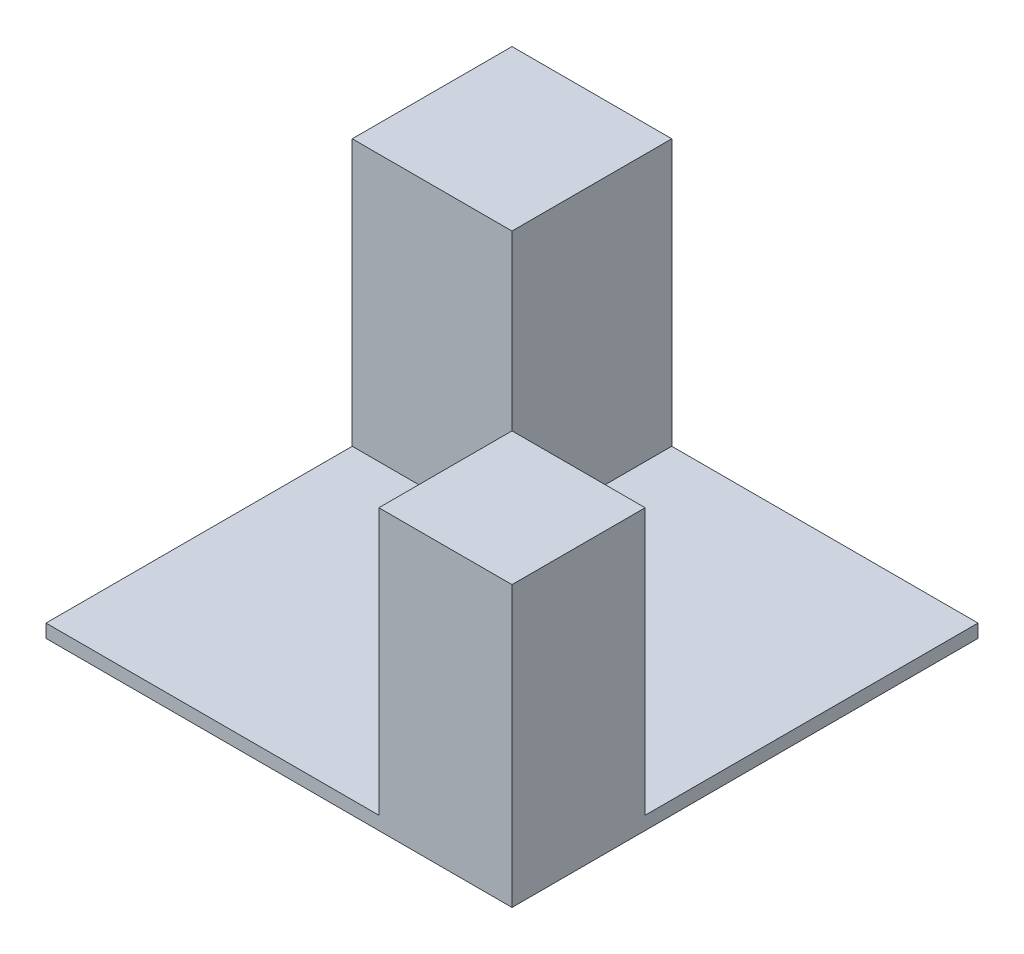
ISO-10303-21;
HEADER;
FILE_DESCRIPTION(('STEP AP214'),'2;1');
FILE_NAME('part.step','',(''),(''),'','','');
FILE_SCHEMA(('AUTOMOTIVE_DESIGN { 1 0 10303 214 1 1 1 1 }'));
ENDSEC;
DATA;
#1=APPLICATION_CONTEXT('core data for automotive mechanical design processes');
#2=APPLICATION_PROTOCOL_DEFINITION('international standard','automotive_design',2000,#1);
#3=PRODUCT_CONTEXT('',#1,'mechanical');
#4=PRODUCT('Part','Part','',(#3));
#5=PRODUCT_RELATED_PRODUCT_CATEGORY('part','',(#4));
#6=PRODUCT_DEFINITION_FORMATION('','',#4);
#7=PRODUCT_DEFINITION_CONTEXT('part definition',#1,'design');
#8=PRODUCT_DEFINITION('design','',#6,#7);
#9=PRODUCT_DEFINITION_SHAPE('','',#8);
#10=(LENGTH_UNIT() NAMED_UNIT(*) SI_UNIT(.MILLI.,.METRE.));
#11=(NAMED_UNIT(*) PLANE_ANGLE_UNIT() SI_UNIT($,.RADIAN.));
#12=(NAMED_UNIT(*) SI_UNIT($,.STERADIAN.) SOLID_ANGLE_UNIT());
#13=UNCERTAINTY_MEASURE_WITH_UNIT(LENGTH_MEASURE(1.E-05),#10,'distance_accuracy_value','');
#14=(GEOMETRIC_REPRESENTATION_CONTEXT(3) GLOBAL_UNCERTAINTY_ASSIGNED_CONTEXT((#13)) GLOBAL_UNIT_ASSIGNED_CONTEXT((#10,
#11,#12)) REPRESENTATION_CONTEXT('',''));
#15=CARTESIAN_POINT('',(0.,0.,0.));
#16=DIRECTION('',(0.,0.,1.));
#17=DIRECTION('',(1.,0.,0.));
#18=AXIS2_PLACEMENT_3D('',#15,#16,#17);
#19=CARTESIAN_POINT('',(0.,1.,0.));
#20=DIRECTION('',(0.,-1.,0.));
#21=DIRECTION('',(0.,0.,-1.));
#22=AXIS2_PLACEMENT_3D('',#19,#20,#21);
#23=PLANE('',#22);
#24=DIRECTION('',(-1.,0.,0.));
#25=VECTOR('',#24,1.);
#26=CARTESIAN_POINT('',(35.,1.,-10.));
#27=LINE('',#26,#25);
#28=CARTESIAN_POINT('',(35.,1.,-10.));
#29=VERTEX_POINT('',#28);
#30=CARTESIAN_POINT('',(25.,1.,-10.));
#31=VERTEX_POINT('',#30);
#32=EDGE_CURVE('E233',#29,#31,#27,.T.);
#33=ORIENTED_EDGE('',*,*,#32,.F.);
#34=DIRECTION('',(0.,0.,-1.));
#35=VECTOR('',#34,1.);
#36=CARTESIAN_POINT('',(35.,1.,0.));
#37=LINE('',#36,#35);
#38=CARTESIAN_POINT('',(35.,1.,-35.));
#39=VERTEX_POINT('',#38);
#40=EDGE_CURVE('E131',#29,#39,#37,.T.);
#41=ORIENTED_EDGE('',*,*,#40,.T.);
#42=DIRECTION('',(-1.,0.,0.));
#43=VECTOR('',#42,1.);
#44=CARTESIAN_POINT('',(0.,1.,-35.));
#45=LINE('',#44,#43);
#46=CARTESIAN_POINT('',(12.,1.,-35.));
#47=VERTEX_POINT('',#46);
#48=EDGE_CURVE('E168',#39,#47,#45,.T.);
#49=ORIENTED_EDGE('',*,*,#48,.T.);
#50=DIRECTION('',(0.,0.,-1.));
#51=VECTOR('',#50,1.);
#52=CARTESIAN_POINT('',(12.,1.,-35.));
#53=LINE('',#52,#51);
#54=CARTESIAN_POINT('',(12.,1.,-23.));
#55=VERTEX_POINT('',#54);
#56=EDGE_CURVE('E135',#55,#47,#53,.T.);
#57=ORIENTED_EDGE('',*,*,#56,.F.);
#58=DIRECTION('',(1.,0.,0.));
#59=VECTOR('',#58,1.);
#60=CARTESIAN_POINT('',(0.,1.,-23.));
#61=LINE('',#60,#59);
#62=CARTESIAN_POINT('',(0.,1.,-23.));
#63=VERTEX_POINT('',#62);
#64=EDGE_CURVE('E132',#63,#55,#61,.T.);
#65=ORIENTED_EDGE('',*,*,#64,.F.);
#66=DIRECTION('',(0.,0.,1.));
#67=VECTOR('',#66,1.);
#68=CARTESIAN_POINT('',(0.,1.,0.));
#69=LINE('',#68,#67);
#70=CARTESIAN_POINT('',(0.,1.,0.));
#71=VERTEX_POINT('',#70);
#72=EDGE_CURVE('E163',#63,#71,#69,.T.);
#73=ORIENTED_EDGE('',*,*,#72,.T.);
#74=DIRECTION('',(1.,0.,0.));
#75=VECTOR('',#74,1.);
#76=CARTESIAN_POINT('',(0.,1.,0.));
#77=LINE('',#76,#75);
#78=CARTESIAN_POINT('',(25.,1.,0.));
#79=VERTEX_POINT('',#78);
#80=EDGE_CURVE('E53',#71,#79,#77,.T.);
#81=ORIENTED_EDGE('',*,*,#80,.T.);
#82=DIRECTION('',(0.,0.,1.));
#83=VECTOR('',#82,1.);
#84=CARTESIAN_POINT('',(25.,1.,0.));
#85=LINE('',#84,#83);
#86=EDGE_CURVE('E48',#31,#79,#85,.T.);
#87=ORIENTED_EDGE('',*,*,#86,.F.);
#88=EDGE_LOOP('',(#33,#41,#49,#57,#65,#73,#81,#87));
#89=FACE_BOUND('',#88,.T.);
#90=ADVANCED_FACE('F33',(#89),#23,.F.);
#91=CARTESIAN_POINT('',(0.,1.,0.));
#92=DIRECTION('',(1.,0.,0.));
#93=DIRECTION('',(0.,0.,-1.));
#94=AXIS2_PLACEMENT_3D('',#91,#92,#93);
#95=PLANE('',#94);
#96=DIRECTION('',(0.,0.,1.));
#97=VECTOR('',#96,1.);
#98=CARTESIAN_POINT('',(0.,0.,0.));
#99=LINE('',#98,#97);
#100=CARTESIAN_POINT('',(0.,0.,-35.));
#101=VERTEX_POINT('',#100);
#102=CARTESIAN_POINT('',(0.,0.,0.));
#103=VERTEX_POINT('',#102);
#104=EDGE_CURVE('E162',#101,#103,#99,.T.);
#105=ORIENTED_EDGE('',*,*,#104,.T.);
#106=DIRECTION('',(0.,-1.,0.));
#107=VECTOR('',#106,1.);
#108=CARTESIAN_POINT('',(0.,1.,0.));
#109=LINE('',#108,#107);
#110=EDGE_CURVE('E11',#71,#103,#109,.T.);
#111=ORIENTED_EDGE('',*,*,#110,.F.);
#112=ORIENTED_EDGE('',*,*,#72,.F.);
#113=DIRECTION('',(0.,-1.,0.));
#114=VECTOR('',#113,1.);
#115=CARTESIAN_POINT('',(0.,21.,-23.));
#116=LINE('',#115,#114);
#117=CARTESIAN_POINT('',(0.,21.,-23.));
#118=VERTEX_POINT('',#117);
#119=EDGE_CURVE('E159',#118,#63,#116,.T.);
#120=ORIENTED_EDGE('',*,*,#119,.F.);
#121=DIRECTION('',(0.,0.,1.));
#122=VECTOR('',#121,1.);
#123=CARTESIAN_POINT('',(0.,21.,-35.));
#124=LINE('',#123,#122);
#125=CARTESIAN_POINT('',(0.,21.,-35.));
#126=VERTEX_POINT('',#125);
#127=EDGE_CURVE('E141',#126,#118,#124,.T.);
#128=ORIENTED_EDGE('',*,*,#127,.F.);
#129=DIRECTION('',(0.,-1.,0.));
#130=VECTOR('',#129,1.);
#131=CARTESIAN_POINT('',(0.,1.,-35.));
#132=LINE('',#131,#130);
#133=EDGE_CURVE('E170',#126,#101,#132,.T.);
#134=ORIENTED_EDGE('',*,*,#133,.T.);
#135=EDGE_LOOP('',(#105,#111,#112,#120,#128,#134));
#136=FACE_BOUND('',#135,.T.);
#137=ADVANCED_FACE('F35',(#136),#95,.F.);
#138=CARTESIAN_POINT('',(0.,1.,0.));
#139=DIRECTION('',(0.,0.,-1.));
#140=DIRECTION('',(-1.,0.,0.));
#141=AXIS2_PLACEMENT_3D('',#138,#139,#140);
#142=PLANE('',#141);
#143=DIRECTION('',(1.,0.,0.));
#144=VECTOR('',#143,1.);
#145=CARTESIAN_POINT('',(0.,0.,0.));
#146=LINE('',#145,#144);
#147=CARTESIAN_POINT('',(35.,0.,0.));
#148=VERTEX_POINT('',#147);
#149=EDGE_CURVE('E173',#103,#148,#146,.T.);
#150=ORIENTED_EDGE('',*,*,#149,.T.);
#151=DIRECTION('',(0.,-1.,0.));
#152=VECTOR('',#151,1.);
#153=CARTESIAN_POINT('',(35.,1.,0.));
#154=LINE('',#153,#152);
#155=CARTESIAN_POINT('',(35.,21.,0.));
#156=VERTEX_POINT('',#155);
#157=EDGE_CURVE('E41',#156,#148,#154,.T.);
#158=ORIENTED_EDGE('',*,*,#157,.F.);
#159=DIRECTION('',(1.,0.,0.));
#160=VECTOR('',#159,1.);
#161=CARTESIAN_POINT('',(35.,21.,0.));
#162=LINE('',#161,#160);
#163=CARTESIAN_POINT('',(25.,21.,0.));
#164=VERTEX_POINT('',#163);
#165=EDGE_CURVE('E125',#164,#156,#162,.T.);
#166=ORIENTED_EDGE('',*,*,#165,.F.);
#167=DIRECTION('',(0.,-1.,0.));
#168=VECTOR('',#167,1.);
#169=CARTESIAN_POINT('',(25.,21.,0.));
#170=LINE('',#169,#168);
#171=EDGE_CURVE('E137',#164,#79,#170,.T.);
#172=ORIENTED_EDGE('',*,*,#171,.T.);
#173=ORIENTED_EDGE('',*,*,#80,.F.);
#174=ORIENTED_EDGE('',*,*,#110,.T.);
#175=EDGE_LOOP('',(#150,#158,#166,#172,#173,#174));
#176=FACE_BOUND('',#175,.T.);
#177=ADVANCED_FACE('F219',(#176),#142,.F.);
#178=CARTESIAN_POINT('',(35.,1.,0.));
#179=DIRECTION('',(-1.,0.,0.));
#180=DIRECTION('',(0.,0.,1.));
#181=AXIS2_PLACEMENT_3D('',#178,#179,#180);
#182=PLANE('',#181);
#183=DIRECTION('',(0.,0.,-1.));
#184=VECTOR('',#183,1.);
#185=CARTESIAN_POINT('',(35.,0.,0.));
#186=LINE('',#185,#184);
#187=CARTESIAN_POINT('',(35.,0.,-35.));
#188=VERTEX_POINT('',#187);
#189=EDGE_CURVE('E175',#148,#188,#186,.T.);
#190=ORIENTED_EDGE('',*,*,#189,.T.);
#191=DIRECTION('',(0.,-1.,0.));
#192=VECTOR('',#191,1.);
#193=CARTESIAN_POINT('',(35.,1.,-35.));
#194=LINE('',#193,#192);
#195=EDGE_CURVE('E180',#39,#188,#194,.T.);
#196=ORIENTED_EDGE('',*,*,#195,.F.);
#197=ORIENTED_EDGE('',*,*,#40,.F.);
#198=DIRECTION('',(0.,-1.,0.));
#199=VECTOR('',#198,1.);
#200=CARTESIAN_POINT('',(35.,21.,-10.));
#201=LINE('',#200,#199);
#202=CARTESIAN_POINT('',(35.,21.,-10.));
#203=VERTEX_POINT('',#202);
#204=EDGE_CURVE('E113',#203,#29,#201,.T.);
#205=ORIENTED_EDGE('',*,*,#204,.F.);
#206=DIRECTION('',(0.,0.,-1.));
#207=VECTOR('',#206,1.);
#208=CARTESIAN_POINT('',(35.,21.,0.));
#209=LINE('',#208,#207);
#210=EDGE_CURVE('E119',#156,#203,#209,.T.);
#211=ORIENTED_EDGE('',*,*,#210,.F.);
#212=ORIENTED_EDGE('',*,*,#157,.T.);
#213=EDGE_LOOP('',(#190,#196,#197,#205,#211,#212));
#214=FACE_BOUND('',#213,.T.);
#215=ADVANCED_FACE('F129',(#214),#182,.F.);
#216=CARTESIAN_POINT('',(0.,1.,-35.));
#217=DIRECTION('',(0.,0.,1.));
#218=DIRECTION('',(1.,0.,0.));
#219=AXIS2_PLACEMENT_3D('',#216,#217,#218);
#220=PLANE('',#219);
#221=DIRECTION('',(-1.,0.,0.));
#222=VECTOR('',#221,1.);
#223=CARTESIAN_POINT('',(0.,0.,-35.));
#224=LINE('',#223,#222);
#225=EDGE_CURVE('E165',#188,#101,#224,.T.);
#226=ORIENTED_EDGE('',*,*,#225,.T.);
#227=ORIENTED_EDGE('',*,*,#133,.F.);
#228=DIRECTION('',(-1.,0.,0.));
#229=VECTOR('',#228,1.);
#230=CARTESIAN_POINT('',(0.,21.,-35.));
#231=LINE('',#230,#229);
#232=CARTESIAN_POINT('',(12.,21.,-35.));
#233=VERTEX_POINT('',#232);
#234=EDGE_CURVE('E148',#233,#126,#231,.T.);
#235=ORIENTED_EDGE('',*,*,#234,.F.);
#236=DIRECTION('',(0.,-1.,0.));
#237=VECTOR('',#236,1.);
#238=CARTESIAN_POINT('',(12.,21.,-35.));
#239=LINE('',#238,#237);
#240=EDGE_CURVE('E150',#233,#47,#239,.T.);
#241=ORIENTED_EDGE('',*,*,#240,.T.);
#242=ORIENTED_EDGE('',*,*,#48,.F.);
#243=ORIENTED_EDGE('',*,*,#195,.T.);
#244=EDGE_LOOP('',(#226,#227,#235,#241,#242,#243));
#245=FACE_BOUND('',#244,.T.);
#246=ADVANCED_FACE('F189',(#245),#220,.F.);
#247=CARTESIAN_POINT('',(0.,0.,0.));
#248=DIRECTION('',(0.,-1.,0.));
#249=DIRECTION('',(0.,0.,-1.));
#250=AXIS2_PLACEMENT_3D('',#247,#248,#249);
#251=PLANE('',#250);
#252=ORIENTED_EDGE('',*,*,#104,.F.);
#253=ORIENTED_EDGE('',*,*,#225,.F.);
#254=ORIENTED_EDGE('',*,*,#189,.F.);
#255=ORIENTED_EDGE('',*,*,#149,.F.);
#256=EDGE_LOOP('',(#252,#253,#254,#255));
#257=FACE_BOUND('',#256,.T.);
#258=ADVANCED_FACE('F187',(#257),#251,.T.);
#259=CARTESIAN_POINT('',(0.,21.,-23.));
#260=DIRECTION('',(0.,0.,-1.));
#261=DIRECTION('',(-1.,0.,0.));
#262=AXIS2_PLACEMENT_3D('',#259,#260,#261);
#263=PLANE('',#262);
#264=ORIENTED_EDGE('',*,*,#64,.T.);
#265=DIRECTION('',(0.,-1.,0.));
#266=VECTOR('',#265,1.);
#267=CARTESIAN_POINT('',(12.,21.,-23.));
#268=LINE('',#267,#266);
#269=CARTESIAN_POINT('',(12.,21.,-23.));
#270=VERTEX_POINT('',#269);
#271=EDGE_CURVE('E156',#270,#55,#268,.T.);
#272=ORIENTED_EDGE('',*,*,#271,.F.);
#273=DIRECTION('',(1.,0.,0.));
#274=VECTOR('',#273,1.);
#275=CARTESIAN_POINT('',(0.,21.,-23.));
#276=LINE('',#275,#274);
#277=EDGE_CURVE('E144',#118,#270,#276,.T.);
#278=ORIENTED_EDGE('',*,*,#277,.F.);
#279=ORIENTED_EDGE('',*,*,#119,.T.);
#280=EDGE_LOOP('',(#264,#272,#278,#279));
#281=FACE_BOUND('',#280,.T.);
#282=ADVANCED_FACE('F205',(#281),#263,.F.);
#283=CARTESIAN_POINT('',(12.,21.,-35.));
#284=DIRECTION('',(-1.,0.,0.));
#285=DIRECTION('',(0.,0.,1.));
#286=AXIS2_PLACEMENT_3D('',#283,#284,#285);
#287=PLANE('',#286);
#288=ORIENTED_EDGE('',*,*,#56,.T.);
#289=ORIENTED_EDGE('',*,*,#240,.F.);
#290=DIRECTION('',(0.,0.,-1.));
#291=VECTOR('',#290,1.);
#292=CARTESIAN_POINT('',(12.,21.,-35.));
#293=LINE('',#292,#291);
#294=EDGE_CURVE('E146',#270,#233,#293,.T.);
#295=ORIENTED_EDGE('',*,*,#294,.F.);
#296=ORIENTED_EDGE('',*,*,#271,.T.);
#297=EDGE_LOOP('',(#288,#289,#295,#296));
#298=FACE_BOUND('',#297,.T.);
#299=ADVANCED_FACE('F203',(#298),#287,.F.);
#300=CARTESIAN_POINT('',(0.,21.,0.));
#301=DIRECTION('',(0.,1.,0.));
#302=DIRECTION('',(0.,0.,1.));
#303=AXIS2_PLACEMENT_3D('',#300,#301,#302);
#304=PLANE('',#303);
#305=ORIENTED_EDGE('',*,*,#127,.T.);
#306=ORIENTED_EDGE('',*,*,#277,.T.);
#307=ORIENTED_EDGE('',*,*,#294,.T.);
#308=ORIENTED_EDGE('',*,*,#234,.T.);
#309=EDGE_LOOP('',(#305,#306,#307,#308));
#310=FACE_BOUND('',#309,.T.);
#311=ADVANCED_FACE('F198',(#310),#304,.T.);
#312=CARTESIAN_POINT('',(35.,21.,-10.));
#313=DIRECTION('',(0.,0.,1.));
#314=DIRECTION('',(1.,0.,0.));
#315=AXIS2_PLACEMENT_3D('',#312,#313,#314);
#316=PLANE('',#315);
#317=ORIENTED_EDGE('',*,*,#32,.T.);
#318=DIRECTION('',(0.,-1.,0.));
#319=VECTOR('',#318,1.);
#320=CARTESIAN_POINT('',(25.,21.,-10.));
#321=LINE('',#320,#319);
#322=CARTESIAN_POINT('',(25.,21.,-10.));
#323=VERTEX_POINT('',#322);
#324=EDGE_CURVE('E115',#323,#31,#321,.T.);
#325=ORIENTED_EDGE('',*,*,#324,.F.);
#326=DIRECTION('',(-1.,0.,0.));
#327=VECTOR('',#326,1.);
#328=CARTESIAN_POINT('',(35.,21.,-10.));
#329=LINE('',#328,#327);
#330=EDGE_CURVE('E109',#203,#323,#329,.T.);
#331=ORIENTED_EDGE('',*,*,#330,.F.);
#332=ORIENTED_EDGE('',*,*,#204,.T.);
#333=EDGE_LOOP('',(#317,#325,#331,#332));
#334=FACE_BOUND('',#333,.T.);
#335=ADVANCED_FACE('F111',(#334),#316,.F.);
#336=CARTESIAN_POINT('',(25.,21.,0.));
#337=DIRECTION('',(1.,0.,0.));
#338=DIRECTION('',(0.,0.,-1.));
#339=AXIS2_PLACEMENT_3D('',#336,#337,#338);
#340=PLANE('',#339);
#341=ORIENTED_EDGE('',*,*,#86,.T.);
#342=ORIENTED_EDGE('',*,*,#171,.F.);
#343=DIRECTION('',(0.,0.,1.));
#344=VECTOR('',#343,1.);
#345=CARTESIAN_POINT('',(25.,21.,0.));
#346=LINE('',#345,#344);
#347=EDGE_CURVE('E118',#323,#164,#346,.T.);
#348=ORIENTED_EDGE('',*,*,#347,.F.);
#349=ORIENTED_EDGE('',*,*,#324,.T.);
#350=EDGE_LOOP('',(#341,#342,#348,#349));
#351=FACE_BOUND('',#350,.T.);
#352=ADVANCED_FACE('F235',(#351),#340,.F.);
#353=CARTESIAN_POINT('',(0.,21.,0.));
#354=DIRECTION('',(0.,1.,0.));
#355=DIRECTION('',(0.,0.,1.));
#356=AXIS2_PLACEMENT_3D('',#353,#354,#355);
#357=PLANE('',#356);
#358=ORIENTED_EDGE('',*,*,#210,.T.);
#359=ORIENTED_EDGE('',*,*,#330,.T.);
#360=ORIENTED_EDGE('',*,*,#347,.T.);
#361=ORIENTED_EDGE('',*,*,#165,.T.);
#362=EDGE_LOOP('',(#358,#359,#360,#361));
#363=FACE_BOUND('',#362,.T.);
#364=ADVANCED_FACE('F123',(#363),#357,.T.);
#365=CLOSED_SHELL('',(#90,#137,#177,#215,#246,#258,#282,#299,#311,#335,#352,#364));
#366=MANIFOLD_SOLID_BREP('B2',#365);
#367=ADVANCED_BREP_SHAPE_REPRESENTATION('',(#18,#366),#14);
#368=SHAPE_DEFINITION_REPRESENTATION(#9,#367);
ENDSEC;
END-ISO-10303-21;
